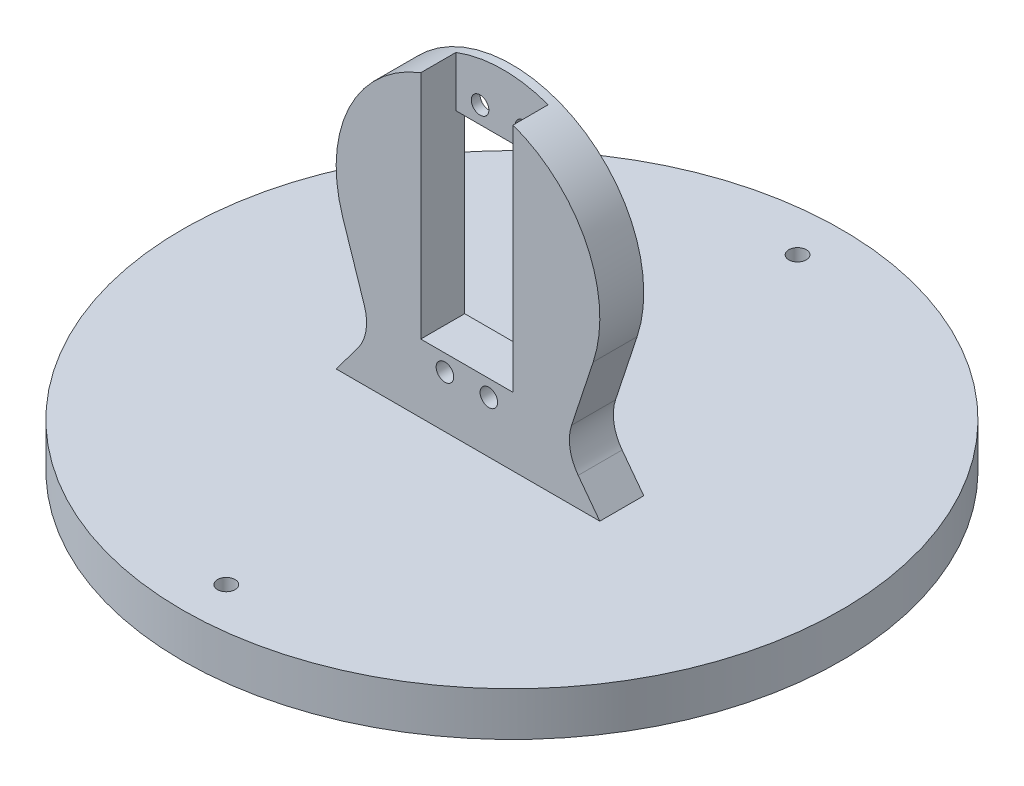
ISO-10303-21;
HEADER;
FILE_DESCRIPTION(('STEP AP214'),'2;1');
FILE_NAME('part.step','',(''),(''),'','','');
FILE_SCHEMA(('AUTOMOTIVE_DESIGN { 1 0 10303 214 1 1 1 1 }'));
ENDSEC;
DATA;
#1=APPLICATION_CONTEXT('core data for automotive mechanical design processes');
#2=APPLICATION_PROTOCOL_DEFINITION('international standard','automotive_design',2000,#1);
#3=PRODUCT_CONTEXT('',#1,'mechanical');
#4=PRODUCT('Part','Part','',(#3));
#5=PRODUCT_RELATED_PRODUCT_CATEGORY('part','',(#4));
#6=PRODUCT_DEFINITION_FORMATION('','',#4);
#7=PRODUCT_DEFINITION_CONTEXT('part definition',#1,'design');
#8=PRODUCT_DEFINITION('design','',#6,#7);
#9=PRODUCT_DEFINITION_SHAPE('','',#8);
#10=(LENGTH_UNIT() NAMED_UNIT(*) SI_UNIT(.MILLI.,.METRE.));
#11=(NAMED_UNIT(*) PLANE_ANGLE_UNIT() SI_UNIT($,.RADIAN.));
#12=(NAMED_UNIT(*) SI_UNIT($,.STERADIAN.) SOLID_ANGLE_UNIT());
#13=UNCERTAINTY_MEASURE_WITH_UNIT(LENGTH_MEASURE(1.E-05),#10,'distance_accuracy_value','');
#14=(GEOMETRIC_REPRESENTATION_CONTEXT(3) GLOBAL_UNCERTAINTY_ASSIGNED_CONTEXT((#13)) GLOBAL_UNIT_ASSIGNED_CONTEXT((#10,
#11,#12)) REPRESENTATION_CONTEXT('',''));
#15=CARTESIAN_POINT('',(0.,0.,0.));
#16=DIRECTION('',(0.,0.,1.));
#17=DIRECTION('',(1.,0.,0.));
#18=AXIS2_PLACEMENT_3D('',#15,#16,#17);
#19=CARTESIAN_POINT('',(0.,10.,0.));
#20=DIRECTION('',(0.,1.,0.));
#21=DIRECTION('',(0.,0.,1.));
#22=AXIS2_PLACEMENT_3D('',#19,#20,#21);
#23=PLANE('',#22);
#24=CARTESIAN_POINT('',(0.,10.,-65.));
#25=DIRECTION('',(0.,1.,0.));
#26=DIRECTION('',(0.,0.,1.));
#27=AXIS2_PLACEMENT_3D('',#24,#25,#26);
#28=CIRCLE('',#27,2.);
#29=CARTESIAN_POINT('',(0.,10.,-63.));
#30=VERTEX_POINT('',#29);
#31=EDGE_CURVE('E370',#30,#30,#28,.T.);
#32=ORIENTED_EDGE('',*,*,#31,.F.);
#33=EDGE_LOOP('',(#32));
#34=FACE_BOUND('',#33,.T.);
#35=CARTESIAN_POINT('',(0.,10.,0.));
#36=DIRECTION('',(0.,1.,0.));
#37=DIRECTION('',(0.,0.,1.));
#38=AXIS2_PLACEMENT_3D('',#35,#36,#37);
#39=CIRCLE('',#38,75.);
#40=CARTESIAN_POINT('',(0.,10.,75.));
#41=VERTEX_POINT('',#40);
#42=EDGE_CURVE('E137',#41,#41,#39,.T.);
#43=ORIENTED_EDGE('',*,*,#42,.T.);
#44=EDGE_LOOP('',(#43));
#45=FACE_BOUND('',#44,.T.);
#46=CARTESIAN_POINT('',(-4.53892574049607E-13,10.,65.));
#47=DIRECTION('',(0.,1.,0.));
#48=DIRECTION('',(0.,0.,1.));
#49=AXIS2_PLACEMENT_3D('',#46,#47,#48);
#50=CIRCLE('',#49,2.);
#51=CARTESIAN_POINT('',(-4.53892574049607E-13,10.,67.));
#52=VERTEX_POINT('',#51);
#53=EDGE_CURVE('E364',#52,#52,#50,.T.);
#54=ORIENTED_EDGE('',*,*,#53,.F.);
#55=EDGE_LOOP('',(#54));
#56=FACE_BOUND('',#55,.T.);
#57=DIRECTION('',(0.,0.,-1.));
#58=VECTOR('',#57,1.);
#59=CARTESIAN_POINT('',(30.,10.,2.));
#60=LINE('',#59,#58);
#61=CARTESIAN_POINT('',(30.,10.,10.));
#62=VERTEX_POINT('',#61);
#63=CARTESIAN_POINT('',(30.,10.,0.));
#64=VERTEX_POINT('',#63);
#65=EDGE_CURVE('E144',#62,#64,#60,.T.);
#66=ORIENTED_EDGE('',*,*,#65,.F.);
#67=DIRECTION('',(-1.,0.,0.));
#68=VECTOR('',#67,1.);
#69=CARTESIAN_POINT('',(0.,10.,10.));
#70=LINE('',#69,#68);
#71=CARTESIAN_POINT('',(-30.,10.,10.));
#72=VERTEX_POINT('',#71);
#73=EDGE_CURVE('E249',#62,#72,#70,.T.);
#74=ORIENTED_EDGE('',*,*,#73,.T.);
#75=DIRECTION('',(0.,0.,-1.));
#76=VECTOR('',#75,1.);
#77=CARTESIAN_POINT('',(-30.,10.,2.));
#78=LINE('',#77,#76);
#79=CARTESIAN_POINT('',(-30.,10.,0.));
#80=VERTEX_POINT('',#79);
#81=EDGE_CURVE('E152',#72,#80,#78,.T.);
#82=ORIENTED_EDGE('',*,*,#81,.T.);
#83=DIRECTION('',(1.,0.,0.));
#84=VECTOR('',#83,1.);
#85=CARTESIAN_POINT('',(0.,10.,0.));
#86=LINE('',#85,#84);
#87=EDGE_CURVE('E313',#80,#64,#86,.T.);
#88=ORIENTED_EDGE('',*,*,#87,.T.);
#89=EDGE_LOOP('',(#66,#74,#82,#88));
#90=FACE_BOUND('',#89,.T.);
#91=ADVANCED_FACE('F129',(#34,#45,#56,#90),#23,.T.);
#92=CARTESIAN_POINT('',(0.,0.,2.));
#93=DIRECTION('',(0.,0.,1.));
#94=DIRECTION('',(1.,0.,0.));
#95=AXIS2_PLACEMENT_3D('',#92,#93,#94);
#96=PLANE('',#95);
#97=CARTESIAN_POINT('',(4.75128860359023,70.3947044695423,2.));
#98=DIRECTION('',(0.,0.,1.));
#99=DIRECTION('',(1.,0.,0.));
#100=AXIS2_PLACEMENT_3D('',#97,#98,#99);
#101=CIRCLE('',#100,2.);
#102=CARTESIAN_POINT('',(6.75128860359023,70.3947044695423,2.));
#103=VERTEX_POINT('',#102);
#104=EDGE_CURVE('E299',#103,#103,#101,.F.);
#105=ORIENTED_EDGE('',*,*,#104,.T.);
#106=EDGE_LOOP('',(#105));
#107=FACE_BOUND('',#106,.T.);
#108=CARTESIAN_POINT('',(-5.24871139640977,70.3947044695423,2.));
#109=DIRECTION('',(0.,0.,1.));
#110=DIRECTION('',(1.,0.,0.));
#111=AXIS2_PLACEMENT_3D('',#108,#109,#110);
#112=CIRCLE('',#111,2.);
#113=CARTESIAN_POINT('',(-3.24871139640977,70.3947044695423,2.));
#114=VERTEX_POINT('',#113);
#115=EDGE_CURVE('E296',#114,#114,#112,.T.);
#116=ORIENTED_EDGE('',*,*,#115,.F.);
#117=EDGE_LOOP('',(#116));
#118=FACE_BOUND('',#117,.T.);
#119=DIRECTION('',(1.,0.,0.));
#120=VECTOR('',#119,1.);
#121=CARTESIAN_POINT('',(0.,66.515431829633,2.));
#122=LINE('',#121,#120);
#123=CARTESIAN_POINT('',(-10.7487113964098,66.515431829633,2.));
#124=VERTEX_POINT('',#123);
#125=CARTESIAN_POINT('',(10.2512886035903,66.515431829633,2.));
#126=VERTEX_POINT('',#125);
#127=EDGE_CURVE('E293',#124,#126,#122,.T.);
#128=ORIENTED_EDGE('',*,*,#127,.T.);
#129=DIRECTION('',(0.,-1.,0.));
#130=VECTOR('',#129,1.);
#131=CARTESIAN_POINT('',(10.2512886035903,0.,2.));
#132=LINE('',#131,#130);
#133=CARTESIAN_POINT('',(10.2512886035903,78.1941675168092,2.));
#134=VERTEX_POINT('',#133);
#135=EDGE_CURVE('E250',#134,#126,#132,.T.);
#136=ORIENTED_EDGE('',*,*,#135,.F.);
#137=CARTESIAN_POINT('',(0.,50.,2.));
#138=DIRECTION('',(0.,0.,1.));
#139=DIRECTION('',(1.,0.,0.));
#140=AXIS2_PLACEMENT_3D('',#137,#138,#139);
#141=CIRCLE('',#140,30.);
#142=CARTESIAN_POINT('',(-10.7487113964098,78.0083059701348,2.));
#143=VERTEX_POINT('',#142);
#144=EDGE_CURVE('E291',#134,#143,#141,.T.);
#145=ORIENTED_EDGE('',*,*,#144,.T.);
#146=DIRECTION('',(0.,-1.,0.));
#147=VECTOR('',#146,1.);
#148=CARTESIAN_POINT('',(-10.7487113964098,0.,2.));
#149=LINE('',#148,#147);
#150=EDGE_CURVE('E12',#143,#124,#149,.T.);
#151=ORIENTED_EDGE('',*,*,#150,.T.);
#152=EDGE_LOOP('',(#128,#136,#145,#151));
#153=FACE_BOUND('',#152,.T.);
#154=ADVANCED_FACE('F384',(#107,#118,#153),#96,.T.);
#155=CARTESIAN_POINT('',(0.,0.,0.));
#156=DIRECTION('',(0.,1.,0.));
#157=DIRECTION('',(0.,0.,1.));
#158=AXIS2_PLACEMENT_3D('',#155,#156,#157);
#159=PLANE('',#158);
#160=CARTESIAN_POINT('',(0.,0.,0.));
#161=DIRECTION('',(0.,1.,0.));
#162=DIRECTION('',(0.,0.,1.));
#163=AXIS2_PLACEMENT_3D('',#160,#161,#162);
#164=CIRCLE('',#163,75.);
#165=CARTESIAN_POINT('',(0.,0.,75.));
#166=VERTEX_POINT('',#165);
#167=EDGE_CURVE('E373',#166,#166,#164,.T.);
#168=ORIENTED_EDGE('',*,*,#167,.F.);
#169=EDGE_LOOP('',(#168));
#170=FACE_BOUND('',#169,.T.);
#171=CARTESIAN_POINT('',(0.,0.,-65.));
#172=DIRECTION('',(0.,1.,0.));
#173=DIRECTION('',(0.,0.,1.));
#174=AXIS2_PLACEMENT_3D('',#171,#172,#173);
#175=CIRCLE('',#174,2.);
#176=CARTESIAN_POINT('',(0.,0.,-63.));
#177=VERTEX_POINT('',#176);
#178=EDGE_CURVE('E367',#177,#177,#175,.T.);
#179=ORIENTED_EDGE('',*,*,#178,.T.);
#180=EDGE_LOOP('',(#179));
#181=FACE_BOUND('',#180,.T.);
#182=CARTESIAN_POINT('',(-4.53892574049607E-13,0.,65.));
#183=DIRECTION('',(0.,1.,0.));
#184=DIRECTION('',(0.,0.,1.));
#185=AXIS2_PLACEMENT_3D('',#182,#183,#184);
#186=CIRCLE('',#185,2.);
#187=CARTESIAN_POINT('',(-4.53892574049607E-13,0.,67.));
#188=VERTEX_POINT('',#187);
#189=EDGE_CURVE('E353',#188,#188,#186,.T.);
#190=ORIENTED_EDGE('',*,*,#189,.T.);
#191=EDGE_LOOP('',(#190));
#192=FACE_BOUND('',#191,.T.);
#193=ADVANCED_FACE('F381',(#170,#181,#192),#159,.F.);
#194=CARTESIAN_POINT('',(0.,10.,0.));
#195=DIRECTION('',(0.,-1.,0.));
#196=DIRECTION('',(0.,0.,-1.));
#197=AXIS2_PLACEMENT_3D('',#194,#195,#196);
#198=CYLINDRICAL_SURFACE('',#197,75.);
#199=ORIENTED_EDGE('',*,*,#42,.F.);
#200=EDGE_LOOP('',(#199));
#201=FACE_BOUND('',#200,.T.);
#202=ORIENTED_EDGE('',*,*,#167,.T.);
#203=EDGE_LOOP('',(#202));
#204=FACE_BOUND('',#203,.T.);
#205=ADVANCED_FACE('F131',(#201,#204),#198,.T.);
#206=CARTESIAN_POINT('',(0.,10.,-65.));
#207=DIRECTION('',(0.,-1.,0.));
#208=DIRECTION('',(0.,0.,-1.));
#209=AXIS2_PLACEMENT_3D('',#206,#207,#208);
#210=CYLINDRICAL_SURFACE('',#209,2.);
#211=ORIENTED_EDGE('',*,*,#31,.T.);
#212=EDGE_LOOP('',(#211));
#213=FACE_BOUND('',#212,.T.);
#214=ORIENTED_EDGE('',*,*,#178,.F.);
#215=EDGE_LOOP('',(#214));
#216=FACE_BOUND('',#215,.T.);
#217=ADVANCED_FACE('F392',(#213,#216),#210,.F.);
#218=CARTESIAN_POINT('',(-4.53892574049607E-13,10.,65.));
#219=DIRECTION('',(0.,-1.,0.));
#220=DIRECTION('',(0.,0.,-1.));
#221=AXIS2_PLACEMENT_3D('',#218,#219,#220);
#222=CYLINDRICAL_SURFACE('',#221,2.);
#223=ORIENTED_EDGE('',*,*,#53,.T.);
#224=EDGE_LOOP('',(#223));
#225=FACE_BOUND('',#224,.T.);
#226=ORIENTED_EDGE('',*,*,#189,.F.);
#227=EDGE_LOOP('',(#226));
#228=FACE_BOUND('',#227,.T.);
#229=ADVANCED_FACE('F389',(#225,#228),#222,.F.);
#230=CARTESIAN_POINT('',(10.2512886035903,0.,2.));
#231=DIRECTION('',(-1.,0.,0.));
#232=DIRECTION('',(0.,0.,1.));
#233=AXIS2_PLACEMENT_3D('',#230,#231,#232);
#234=PLANE('',#233);
#235=DIRECTION('',(0.,1.,0.));
#236=VECTOR('',#235,1.);
#237=CARTESIAN_POINT('',(10.2512886035903,0.,0.));
#238=LINE('',#237,#236);
#239=CARTESIAN_POINT('',(10.2512886035902,25.515431829633,0.));
#240=VERTEX_POINT('',#239);
#241=CARTESIAN_POINT('',(10.2512886035903,66.515431829633,0.));
#242=VERTEX_POINT('',#241);
#243=EDGE_CURVE('E321',#240,#242,#238,.T.);
#244=ORIENTED_EDGE('',*,*,#243,.F.);
#245=DIRECTION('',(0.,0.,-1.));
#246=VECTOR('',#245,1.);
#247=CARTESIAN_POINT('',(10.2512886035902,25.515431829633,2.));
#248=LINE('',#247,#246);
#249=CARTESIAN_POINT('',(10.2512886035903,25.515431829633,10.));
#250=VERTEX_POINT('',#249);
#251=EDGE_CURVE('E351',#250,#240,#248,.T.);
#252=ORIENTED_EDGE('',*,*,#251,.F.);
#253=DIRECTION('',(0.,-1.,0.));
#254=VECTOR('',#253,1.);
#255=CARTESIAN_POINT('',(10.2512886035903,0.,10.));
#256=LINE('',#255,#254);
#257=CARTESIAN_POINT('',(10.2512886035903,78.1941675168092,10.));
#258=VERTEX_POINT('',#257);
#259=EDGE_CURVE('E261',#258,#250,#256,.T.);
#260=ORIENTED_EDGE('',*,*,#259,.F.);
#261=DIRECTION('',(0.,0.,-1.));
#262=VECTOR('',#261,1.);
#263=CARTESIAN_POINT('',(10.2512886035903,78.1941675168092,10.));
#264=LINE('',#263,#262);
#265=EDGE_CURVE('E287',#258,#134,#264,.T.);
#266=ORIENTED_EDGE('',*,*,#265,.T.);
#267=ORIENTED_EDGE('',*,*,#135,.T.);
#268=DIRECTION('',(0.,0.,-1.));
#269=VECTOR('',#268,1.);
#270=CARTESIAN_POINT('',(10.2512886035903,66.515431829633,2.));
#271=LINE('',#270,#269);
#272=EDGE_CURVE('E344',#126,#242,#271,.T.);
#273=ORIENTED_EDGE('',*,*,#272,.T.);
#274=EDGE_LOOP('',(#244,#252,#260,#266,#267,#273));
#275=FACE_BOUND('',#274,.T.);
#276=ADVANCED_FACE('F391',(#275),#234,.T.);
#277=CARTESIAN_POINT('',(0.,25.515431829633,2.));
#278=DIRECTION('',(0.,1.,0.));
#279=DIRECTION('',(-1.,0.,0.));
#280=AXIS2_PLACEMENT_3D('',#277,#278,#279);
#281=PLANE('',#280);
#282=DIRECTION('',(1.,0.,0.));
#283=VECTOR('',#282,1.);
#284=CARTESIAN_POINT('',(0.,25.515431829633,0.));
#285=LINE('',#284,#283);
#286=CARTESIAN_POINT('',(-10.7487113964098,25.515431829633,0.));
#287=VERTEX_POINT('',#286);
#288=EDGE_CURVE('E324',#287,#240,#285,.T.);
#289=ORIENTED_EDGE('',*,*,#288,.F.);
#290=DIRECTION('',(0.,0.,-1.));
#291=VECTOR('',#290,1.);
#292=CARTESIAN_POINT('',(-10.7487113964098,25.515431829633,2.));
#293=LINE('',#292,#291);
#294=CARTESIAN_POINT('',(-10.7487113964098,25.515431829633,10.));
#295=VERTEX_POINT('',#294);
#296=EDGE_CURVE('E349',#295,#287,#293,.T.);
#297=ORIENTED_EDGE('',*,*,#296,.F.);
#298=DIRECTION('',(-1.,0.,0.));
#299=VECTOR('',#298,1.);
#300=CARTESIAN_POINT('',(0.,25.515431829633,10.));
#301=LINE('',#300,#299);
#302=EDGE_CURVE('E264',#250,#295,#301,.T.);
#303=ORIENTED_EDGE('',*,*,#302,.F.);
#304=ORIENTED_EDGE('',*,*,#251,.T.);
#305=EDGE_LOOP('',(#289,#297,#303,#304));
#306=FACE_BOUND('',#305,.T.);
#307=ADVANCED_FACE('F400',(#306),#281,.T.);
#308=CARTESIAN_POINT('',(-10.7487113964098,0.,2.));
#309=DIRECTION('',(1.,0.,0.));
#310=DIRECTION('',(0.,1.,0.));
#311=AXIS2_PLACEMENT_3D('',#308,#309,#310);
#312=PLANE('',#311);
#313=DIRECTION('',(0.,-1.,0.));
#314=VECTOR('',#313,1.);
#315=CARTESIAN_POINT('',(-10.7487113964098,0.,0.));
#316=LINE('',#315,#314);
#317=CARTESIAN_POINT('',(-10.7487113964098,66.515431829633,0.));
#318=VERTEX_POINT('',#317);
#319=EDGE_CURVE('E327',#318,#287,#316,.T.);
#320=ORIENTED_EDGE('',*,*,#319,.F.);
#321=DIRECTION('',(0.,0.,-1.));
#322=VECTOR('',#321,1.);
#323=CARTESIAN_POINT('',(-10.7487113964098,66.515431829633,2.));
#324=LINE('',#323,#322);
#325=EDGE_CURVE('E346',#124,#318,#324,.T.);
#326=ORIENTED_EDGE('',*,*,#325,.F.);
#327=ORIENTED_EDGE('',*,*,#150,.F.);
#328=DIRECTION('',(0.,0.,-1.));
#329=VECTOR('',#328,1.);
#330=CARTESIAN_POINT('',(-10.7487113964098,78.0083059701348,10.));
#331=LINE('',#330,#329);
#332=CARTESIAN_POINT('',(-10.7487113964098,78.0083059701348,10.));
#333=VERTEX_POINT('',#332);
#334=EDGE_CURVE('E281',#333,#143,#331,.T.);
#335=ORIENTED_EDGE('',*,*,#334,.F.);
#336=DIRECTION('',(0.,1.,0.));
#337=VECTOR('',#336,1.);
#338=CARTESIAN_POINT('',(-10.7487113964098,0.,10.));
#339=LINE('',#338,#337);
#340=EDGE_CURVE('E267',#295,#333,#339,.T.);
#341=ORIENTED_EDGE('',*,*,#340,.F.);
#342=ORIENTED_EDGE('',*,*,#296,.T.);
#343=EDGE_LOOP('',(#320,#326,#327,#335,#341,#342));
#344=FACE_BOUND('',#343,.T.);
#345=ADVANCED_FACE('F435',(#344),#312,.T.);
#346=CARTESIAN_POINT('',(0.,50.,2.));
#347=DIRECTION('',(0.,0.,-1.));
#348=DIRECTION('',(-1.,0.,0.));
#349=AXIS2_PLACEMENT_3D('',#346,#347,#348);
#350=CYLINDRICAL_SURFACE('',#349,30.);
#351=CARTESIAN_POINT('',(0.,50.,0.));
#352=DIRECTION('',(0.,0.,1.));
#353=DIRECTION('',(1.,0.,0.));
#354=AXIS2_PLACEMENT_3D('',#351,#352,#353);
#355=CIRCLE('',#354,30.);
#356=CARTESIAN_POINT('',(28.4915538818298,40.6068451839231,0.));
#357=VERTEX_POINT('',#356);
#358=CARTESIAN_POINT('',(-28.4915538818298,40.6068451839231,0.));
#359=VERTEX_POINT('',#358);
#360=EDGE_CURVE('E290',#357,#359,#355,.T.);
#361=ORIENTED_EDGE('',*,*,#360,.T.);
#362=DIRECTION('',(0.,0.,-1.));
#363=VECTOR('',#362,1.);
#364=CARTESIAN_POINT('',(-28.4915538818298,40.6068451839231,2.));
#365=LINE('',#364,#363);
#366=CARTESIAN_POINT('',(-28.4915538818298,40.6068451839231,10.));
#367=VERTEX_POINT('',#366);
#368=EDGE_CURVE('E347',#367,#359,#365,.T.);
#369=ORIENTED_EDGE('',*,*,#368,.F.);
#370=CARTESIAN_POINT('',(0.,50.,10.));
#371=DIRECTION('',(0.,0.,1.));
#372=DIRECTION('',(1.,0.,0.));
#373=AXIS2_PLACEMENT_3D('',#370,#371,#372);
#374=CIRCLE('',#373,30.);
#375=EDGE_CURVE('E269',#333,#367,#374,.T.);
#376=ORIENTED_EDGE('',*,*,#375,.F.);
#377=ORIENTED_EDGE('',*,*,#334,.T.);
#378=ORIENTED_EDGE('',*,*,#144,.F.);
#379=ORIENTED_EDGE('',*,*,#265,.F.);
#380=CARTESIAN_POINT('',(0.,50.,10.));
#381=DIRECTION('',(0.,0.,1.));
#382=DIRECTION('',(1.,0.,0.));
#383=AXIS2_PLACEMENT_3D('',#380,#381,#382);
#384=CIRCLE('',#383,30.);
#385=CARTESIAN_POINT('',(28.4915538818298,40.6068451839231,10.));
#386=VERTEX_POINT('',#385);
#387=EDGE_CURVE('E256',#386,#258,#384,.T.);
#388=ORIENTED_EDGE('',*,*,#387,.F.);
#389=DIRECTION('',(0.,0.,-1.));
#390=VECTOR('',#389,1.);
#391=CARTESIAN_POINT('',(28.4915538818298,40.6068451839231,2.));
#392=LINE('',#391,#390);
#393=EDGE_CURVE('E302',#386,#357,#392,.T.);
#394=ORIENTED_EDGE('',*,*,#393,.T.);
#395=EDGE_LOOP('',(#361,#369,#376,#377,#378,#379,#388,#394));
#396=FACE_BOUND('',#395,.T.);
#397=ADVANCED_FACE('F443',(#396),#350,.T.);
#398=CARTESIAN_POINT('',(-13.6234662950173,-4.49141273836642,2.));
#399=DIRECTION('',(0.94971846272766,0.313105160535898,0.));
#400=DIRECTION('',(-0.313105160535898,0.94971846272766,0.));
#401=AXIS2_PLACEMENT_3D('',#398,#399,#400);
#402=PLANE('',#401);
#403=DIRECTION('',(0.313105160535898,-0.94971846272766,0.));
#404=VECTOR('',#403,1.);
#405=CARTESIAN_POINT('',(-13.6234662950173,-4.49141273836642,0.));
#406=LINE('',#405,#404);
#407=CARTESIAN_POINT('',(-23.5767501294549,25.6991385963836,0.));
#408=VERTEX_POINT('',#407);
#409=EDGE_CURVE('E305',#359,#408,#406,.T.);
#410=ORIENTED_EDGE('',*,*,#409,.T.);
#411=DIRECTION('',(0.,0.,-1.));
#412=VECTOR('',#411,1.);
#413=CARTESIAN_POINT('',(-23.5767501294549,25.6991385963836,2.));
#414=LINE('',#413,#412);
#415=CARTESIAN_POINT('',(-23.5767501294549,25.6991385963836,10.));
#416=VERTEX_POINT('',#415);
#417=EDGE_CURVE('E360',#416,#408,#414,.T.);
#418=ORIENTED_EDGE('',*,*,#417,.F.);
#419=DIRECTION('',(-0.313105160535898,0.94971846272766,0.));
#420=VECTOR('',#419,1.);
#421=CARTESIAN_POINT('',(-13.6234662950173,-4.49141273836642,10.));
#422=LINE('',#421,#420);
#423=EDGE_CURVE('E272',#416,#367,#422,.T.);
#424=ORIENTED_EDGE('',*,*,#423,.T.);
#425=ORIENTED_EDGE('',*,*,#368,.T.);
#426=EDGE_LOOP('',(#410,#418,#424,#425));
#427=FACE_BOUND('',#426,.T.);
#428=ADVANCED_FACE('F451',(#427),#402,.F.);
#429=CARTESIAN_POINT('',(-33.0739347567315,22.5680869910246,2.));
#430=DIRECTION('',(0.,0.,-1.));
#431=DIRECTION('',(-1.,0.,0.));
#432=AXIS2_PLACEMENT_3D('',#429,#430,#431);
#433=CYLINDRICAL_SURFACE('',#432,10.);
#434=CARTESIAN_POINT('',(-33.0739347567315,22.5680869910246,0.));
#435=DIRECTION('',(0.,0.,1.));
#436=DIRECTION('',(1.,0.,0.));
#437=AXIS2_PLACEMENT_3D('',#434,#435,#436);
#438=CIRCLE('',#437,10.);
#439=CARTESIAN_POINT('',(-25.0739347567315,16.5680869910246,0.));
#440=VERTEX_POINT('',#439);
#441=EDGE_CURVE('E308',#440,#408,#438,.T.);
#442=ORIENTED_EDGE('',*,*,#441,.F.);
#443=DIRECTION('',(0.,0.,-1.));
#444=VECTOR('',#443,1.);
#445=CARTESIAN_POINT('',(-25.0739347567315,16.5680869910246,2.));
#446=LINE('',#445,#444);
#447=CARTESIAN_POINT('',(-25.0739347567315,16.5680869910246,10.));
#448=VERTEX_POINT('',#447);
#449=EDGE_CURVE('E358',#448,#440,#446,.T.);
#450=ORIENTED_EDGE('',*,*,#449,.F.);
#451=CARTESIAN_POINT('',(-33.0739347567315,22.5680869910246,10.));
#452=DIRECTION('',(0.,0.,1.));
#453=DIRECTION('',(1.,0.,0.));
#454=AXIS2_PLACEMENT_3D('',#451,#452,#453);
#455=CIRCLE('',#454,10.);
#456=EDGE_CURVE('E275',#448,#416,#455,.T.);
#457=ORIENTED_EDGE('',*,*,#456,.T.);
#458=ORIENTED_EDGE('',*,*,#417,.T.);
#459=EDGE_LOOP('',(#442,#450,#457,#458));
#460=FACE_BOUND('',#459,.T.);
#461=ADVANCED_FACE('F458',(#460),#433,.F.);
#462=CARTESIAN_POINT('',(-24.,18.,2.));
#463=DIRECTION('',(0.799999999999999,-0.600000000000001,0.));
#464=DIRECTION('',(0.600000000000001,0.799999999999999,0.));
#465=AXIS2_PLACEMENT_3D('',#462,#463,#464);
#466=PLANE('',#465);
#467=DIRECTION('',(-0.600000000000001,-0.799999999999999,0.));
#468=VECTOR('',#467,1.);
#469=CARTESIAN_POINT('',(-24.,18.,0.));
#470=LINE('',#469,#468);
#471=EDGE_CURVE('E311',#440,#80,#470,.T.);
#472=ORIENTED_EDGE('',*,*,#471,.T.);
#473=ORIENTED_EDGE('',*,*,#81,.F.);
#474=DIRECTION('',(0.600000000000001,0.799999999999999,0.));
#475=VECTOR('',#474,1.);
#476=CARTESIAN_POINT('',(-24.,18.,10.));
#477=LINE('',#476,#475);
#478=EDGE_CURVE('E278',#72,#448,#477,.T.);
#479=ORIENTED_EDGE('',*,*,#478,.T.);
#480=ORIENTED_EDGE('',*,*,#449,.T.);
#481=EDGE_LOOP('',(#472,#473,#479,#480));
#482=FACE_BOUND('',#481,.T.);
#483=ADVANCED_FACE('F466',(#482),#466,.F.);
#484=CARTESIAN_POINT('',(24.,18.,2.));
#485=DIRECTION('',(0.799999999999999,0.600000000000001,0.));
#486=DIRECTION('',(-0.600000000000001,0.799999999999999,0.));
#487=AXIS2_PLACEMENT_3D('',#484,#485,#486);
#488=PLANE('',#487);
#489=DIRECTION('',(0.600000000000001,-0.799999999999999,0.));
#490=VECTOR('',#489,1.);
#491=CARTESIAN_POINT('',(24.,18.,0.));
#492=LINE('',#491,#490);
#493=CARTESIAN_POINT('',(25.0739347567315,16.5680869910246,0.));
#494=VERTEX_POINT('',#493);
#495=EDGE_CURVE('E235',#494,#64,#492,.T.);
#496=ORIENTED_EDGE('',*,*,#495,.F.);
#497=DIRECTION('',(0.,0.,-1.));
#498=VECTOR('',#497,1.);
#499=CARTESIAN_POINT('',(25.0739347567315,16.5680869910246,2.));
#500=LINE('',#499,#498);
#501=CARTESIAN_POINT('',(25.0739347567315,16.5680869910246,10.));
#502=VERTEX_POINT('',#501);
#503=EDGE_CURVE('E230',#502,#494,#500,.T.);
#504=ORIENTED_EDGE('',*,*,#503,.F.);
#505=DIRECTION('',(-0.600000000000001,0.799999999999999,0.));
#506=VECTOR('',#505,1.);
#507=CARTESIAN_POINT('',(24.,18.,10.));
#508=LINE('',#507,#506);
#509=EDGE_CURVE('E233',#62,#502,#508,.T.);
#510=ORIENTED_EDGE('',*,*,#509,.F.);
#511=ORIENTED_EDGE('',*,*,#65,.T.);
#512=EDGE_LOOP('',(#496,#504,#510,#511));
#513=FACE_BOUND('',#512,.T.);
#514=ADVANCED_FACE('F232',(#513),#488,.T.);
#515=CARTESIAN_POINT('',(33.0739347567315,22.5680869910246,2.));
#516=DIRECTION('',(0.,0.,-1.));
#517=DIRECTION('',(-1.,0.,0.));
#518=AXIS2_PLACEMENT_3D('',#515,#516,#517);
#519=CYLINDRICAL_SURFACE('',#518,10.);
#520=CARTESIAN_POINT('',(33.0739347567315,22.5680869910246,0.));
#521=DIRECTION('',(0.,0.,1.));
#522=DIRECTION('',(1.,0.,0.));
#523=AXIS2_PLACEMENT_3D('',#520,#521,#522);
#524=CIRCLE('',#523,10.);
#525=CARTESIAN_POINT('',(23.5767501294549,25.6991385963836,0.));
#526=VERTEX_POINT('',#525);
#527=EDGE_CURVE('E316',#526,#494,#524,.T.);
#528=ORIENTED_EDGE('',*,*,#527,.F.);
#529=DIRECTION('',(0.,0.,-1.));
#530=VECTOR('',#529,1.);
#531=CARTESIAN_POINT('',(23.5767501294549,25.6991385963836,2.));
#532=LINE('',#531,#530);
#533=CARTESIAN_POINT('',(23.5767501294549,25.6991385963836,10.));
#534=VERTEX_POINT('',#533);
#535=EDGE_CURVE('E240',#534,#526,#532,.T.);
#536=ORIENTED_EDGE('',*,*,#535,.F.);
#537=CARTESIAN_POINT('',(33.0739347567315,22.5680869910246,10.));
#538=DIRECTION('',(0.,0.,1.));
#539=DIRECTION('',(1.,0.,0.));
#540=AXIS2_PLACEMENT_3D('',#537,#538,#539);
#541=CIRCLE('',#540,10.);
#542=EDGE_CURVE('E247',#534,#502,#541,.T.);
#543=ORIENTED_EDGE('',*,*,#542,.T.);
#544=ORIENTED_EDGE('',*,*,#503,.T.);
#545=EDGE_LOOP('',(#528,#536,#543,#544));
#546=FACE_BOUND('',#545,.T.);
#547=ADVANCED_FACE('F252',(#546),#519,.F.);
#548=CARTESIAN_POINT('',(-5.24871139640977,70.3947044695423,2.));
#549=DIRECTION('',(0.,0.,-1.));
#550=DIRECTION('',(-1.,0.,0.));
#551=AXIS2_PLACEMENT_3D('',#548,#549,#550);
#552=CYLINDRICAL_SURFACE('',#551,2.);
#553=ORIENTED_EDGE('',*,*,#115,.T.);
#554=EDGE_LOOP('',(#553));
#555=FACE_BOUND('',#554,.T.);
#556=CARTESIAN_POINT('',(-5.24871139640977,70.3947044695423,0.));
#557=DIRECTION('',(0.,0.,1.));
#558=DIRECTION('',(1.,0.,0.));
#559=AXIS2_PLACEMENT_3D('',#556,#557,#558);
#560=CIRCLE('',#559,2.);
#561=CARTESIAN_POINT('',(-3.24871139640977,70.3947044695423,0.));
#562=VERTEX_POINT('',#561);
#563=EDGE_CURVE('E339',#562,#562,#560,.T.);
#564=ORIENTED_EDGE('',*,*,#563,.F.);
#565=EDGE_LOOP('',(#564));
#566=FACE_BOUND('',#565,.T.);
#567=ADVANCED_FACE('F486',(#555,#566),#552,.F.);
#568=CARTESIAN_POINT('',(4.75128860359023,21.7647044695424,2.));
#569=DIRECTION('',(0.,0.,-1.));
#570=DIRECTION('',(-1.,0.,0.));
#571=AXIS2_PLACEMENT_3D('',#568,#569,#570);
#572=CYLINDRICAL_SURFACE('',#571,2.);
#573=CARTESIAN_POINT('',(4.75128860359023,21.7647044695424,0.));
#574=DIRECTION('',(0.,0.,1.));
#575=DIRECTION('',(1.,0.,0.));
#576=AXIS2_PLACEMENT_3D('',#573,#574,#575);
#577=CIRCLE('',#576,2.);
#578=CARTESIAN_POINT('',(6.75128860359023,21.7647044695424,0.));
#579=VERTEX_POINT('',#578);
#580=EDGE_CURVE('E336',#579,#579,#577,.F.);
#581=ORIENTED_EDGE('',*,*,#580,.T.);
#582=EDGE_LOOP('',(#581));
#583=FACE_BOUND('',#582,.T.);
#584=CARTESIAN_POINT('',(4.75128860359023,21.7647044695424,10.));
#585=DIRECTION('',(0.,0.,1.));
#586=DIRECTION('',(1.,0.,0.));
#587=AXIS2_PLACEMENT_3D('',#584,#585,#586);
#588=CIRCLE('',#587,2.);
#589=CARTESIAN_POINT('',(6.75128860359023,21.7647044695424,10.));
#590=VERTEX_POINT('',#589);
#591=EDGE_CURVE('E775',#590,#590,#588,.T.);
#592=ORIENTED_EDGE('',*,*,#591,.T.);
#593=EDGE_LOOP('',(#592));
#594=FACE_BOUND('',#593,.T.);
#595=ADVANCED_FACE('F493',(#583,#594),#572,.F.);
#596=CARTESIAN_POINT('',(-5.24871139640977,21.7647044695424,2.));
#597=DIRECTION('',(0.,0.,-1.));
#598=DIRECTION('',(-1.,0.,0.));
#599=AXIS2_PLACEMENT_3D('',#596,#597,#598);
#600=CYLINDRICAL_SURFACE('',#599,2.);
#601=CARTESIAN_POINT('',(-5.24871139640977,21.7647044695424,0.));
#602=DIRECTION('',(0.,0.,1.));
#603=DIRECTION('',(1.,0.,0.));
#604=AXIS2_PLACEMENT_3D('',#601,#602,#603);
#605=CIRCLE('',#604,2.);
#606=CARTESIAN_POINT('',(-3.24871139640977,21.7647044695424,0.));
#607=VERTEX_POINT('',#606);
#608=EDGE_CURVE('E333',#607,#607,#605,.T.);
#609=ORIENTED_EDGE('',*,*,#608,.F.);
#610=EDGE_LOOP('',(#609));
#611=FACE_BOUND('',#610,.T.);
#612=CARTESIAN_POINT('',(-5.24871139640977,21.7647044695424,10.));
#613=DIRECTION('',(0.,0.,1.));
#614=DIRECTION('',(1.,0.,0.));
#615=AXIS2_PLACEMENT_3D('',#612,#613,#614);
#616=CIRCLE('',#615,2.);
#617=CARTESIAN_POINT('',(-3.24871139640977,21.7647044695424,10.));
#618=VERTEX_POINT('',#617);
#619=EDGE_CURVE('E284',#618,#618,#616,.T.);
#620=ORIENTED_EDGE('',*,*,#619,.T.);
#621=EDGE_LOOP('',(#620));
#622=FACE_BOUND('',#621,.T.);
#623=ADVANCED_FACE('F500',(#611,#622),#600,.F.);
#624=CARTESIAN_POINT('',(0.,66.515431829633,2.));
#625=DIRECTION('',(0.,1.,0.));
#626=DIRECTION('',(0.,0.,1.));
#627=AXIS2_PLACEMENT_3D('',#624,#625,#626);
#628=PLANE('',#627);
#629=DIRECTION('',(1.,0.,0.));
#630=VECTOR('',#629,1.);
#631=CARTESIAN_POINT('',(0.,66.515431829633,0.));
#632=LINE('',#631,#630);
#633=EDGE_CURVE('E330',#318,#242,#632,.T.);
#634=ORIENTED_EDGE('',*,*,#633,.T.);
#635=ORIENTED_EDGE('',*,*,#272,.F.);
#636=ORIENTED_EDGE('',*,*,#127,.F.);
#637=ORIENTED_EDGE('',*,*,#325,.T.);
#638=EDGE_LOOP('',(#634,#635,#636,#637));
#639=FACE_BOUND('',#638,.T.);
#640=ADVANCED_FACE('F508',(#639),#628,.F.);
#641=CARTESIAN_POINT('',(13.6234662950173,-4.49141273836642,2.));
#642=DIRECTION('',(0.94971846272766,-0.313105160535898,0.));
#643=DIRECTION('',(0.313105160535898,0.94971846272766,0.));
#644=AXIS2_PLACEMENT_3D('',#641,#642,#643);
#645=PLANE('',#644);
#646=DIRECTION('',(-0.313105160535898,-0.94971846272766,0.));
#647=VECTOR('',#646,1.);
#648=CARTESIAN_POINT('',(13.6234662950173,-4.49141273836642,0.));
#649=LINE('',#648,#647);
#650=EDGE_CURVE('E318',#357,#526,#649,.T.);
#651=ORIENTED_EDGE('',*,*,#650,.F.);
#652=ORIENTED_EDGE('',*,*,#393,.F.);
#653=DIRECTION('',(0.313105160535898,0.94971846272766,0.));
#654=VECTOR('',#653,1.);
#655=CARTESIAN_POINT('',(13.6234662950173,-4.49141273836642,10.));
#656=LINE('',#655,#654);
#657=EDGE_CURVE('E254',#534,#386,#656,.T.);
#658=ORIENTED_EDGE('',*,*,#657,.F.);
#659=ORIENTED_EDGE('',*,*,#535,.T.);
#660=EDGE_LOOP('',(#651,#652,#658,#659));
#661=FACE_BOUND('',#660,.T.);
#662=ADVANCED_FACE('F516',(#661),#645,.T.);
#663=CARTESIAN_POINT('',(4.75128860359023,70.3947044695423,2.));
#664=DIRECTION('',(0.,0.,-1.));
#665=DIRECTION('',(-1.,0.,0.));
#666=AXIS2_PLACEMENT_3D('',#663,#664,#665);
#667=CYLINDRICAL_SURFACE('',#666,2.);
#668=ORIENTED_EDGE('',*,*,#104,.F.);
#669=EDGE_LOOP('',(#668));
#670=FACE_BOUND('',#669,.T.);
#671=CARTESIAN_POINT('',(4.75128860359023,70.3947044695423,0.));
#672=DIRECTION('',(0.,0.,1.));
#673=DIRECTION('',(1.,0.,0.));
#674=AXIS2_PLACEMENT_3D('',#671,#672,#673);
#675=CIRCLE('',#674,2.);
#676=CARTESIAN_POINT('',(6.75128860359023,70.3947044695423,0.));
#677=VERTEX_POINT('',#676);
#678=EDGE_CURVE('E294',#677,#677,#675,.F.);
#679=ORIENTED_EDGE('',*,*,#678,.T.);
#680=EDGE_LOOP('',(#679));
#681=FACE_BOUND('',#680,.T.);
#682=ADVANCED_FACE('F524',(#670,#681),#667,.F.);
#683=CARTESIAN_POINT('',(0.,0.,0.));
#684=DIRECTION('',(0.,0.,1.));
#685=DIRECTION('',(1.,0.,0.));
#686=AXIS2_PLACEMENT_3D('',#683,#684,#685);
#687=PLANE('',#686);
#688=ORIENTED_EDGE('',*,*,#360,.F.);
#689=ORIENTED_EDGE('',*,*,#650,.T.);
#690=ORIENTED_EDGE('',*,*,#527,.T.);
#691=ORIENTED_EDGE('',*,*,#495,.T.);
#692=ORIENTED_EDGE('',*,*,#87,.F.);
#693=ORIENTED_EDGE('',*,*,#471,.F.);
#694=ORIENTED_EDGE('',*,*,#441,.T.);
#695=ORIENTED_EDGE('',*,*,#409,.F.);
#696=EDGE_LOOP('',(#688,#689,#690,#691,#692,#693,#694,#695));
#697=FACE_BOUND('',#696,.T.);
#698=ORIENTED_EDGE('',*,*,#243,.T.);
#699=ORIENTED_EDGE('',*,*,#633,.F.);
#700=ORIENTED_EDGE('',*,*,#319,.T.);
#701=ORIENTED_EDGE('',*,*,#288,.T.);
#702=EDGE_LOOP('',(#698,#699,#700,#701));
#703=FACE_BOUND('',#702,.T.);
#704=ORIENTED_EDGE('',*,*,#608,.T.);
#705=EDGE_LOOP('',(#704));
#706=FACE_BOUND('',#705,.T.);
#707=ORIENTED_EDGE('',*,*,#580,.F.);
#708=EDGE_LOOP('',(#707));
#709=FACE_BOUND('',#708,.T.);
#710=ORIENTED_EDGE('',*,*,#563,.T.);
#711=EDGE_LOOP('',(#710));
#712=FACE_BOUND('',#711,.T.);
#713=ORIENTED_EDGE('',*,*,#678,.F.);
#714=EDGE_LOOP('',(#713));
#715=FACE_BOUND('',#714,.T.);
#716=ADVANCED_FACE('F532',(#697,#703,#706,#709,#712,#715),#687,.F.);
#717=CARTESIAN_POINT('',(33.0739347567315,22.5680869910246,10.));
#718=DIRECTION('',(0.,0.,1.));
#719=DIRECTION('',(1.,0.,0.));
#720=AXIS2_PLACEMENT_3D('',#717,#718,#719);
#721=PLANE('',#720);
#722=ORIENTED_EDGE('',*,*,#619,.F.);
#723=EDGE_LOOP('',(#722));
#724=FACE_BOUND('',#723,.T.);
#725=ORIENTED_EDGE('',*,*,#509,.T.);
#726=ORIENTED_EDGE('',*,*,#542,.F.);
#727=ORIENTED_EDGE('',*,*,#657,.T.);
#728=ORIENTED_EDGE('',*,*,#387,.T.);
#729=ORIENTED_EDGE('',*,*,#259,.T.);
#730=ORIENTED_EDGE('',*,*,#302,.T.);
#731=ORIENTED_EDGE('',*,*,#340,.T.);
#732=ORIENTED_EDGE('',*,*,#375,.T.);
#733=ORIENTED_EDGE('',*,*,#423,.F.);
#734=ORIENTED_EDGE('',*,*,#456,.F.);
#735=ORIENTED_EDGE('',*,*,#478,.F.);
#736=ORIENTED_EDGE('',*,*,#73,.F.);
#737=EDGE_LOOP('',(#725,#726,#727,#728,#729,#730,#731,#732,#733,#734,#735,#736));
#738=FACE_BOUND('',#737,.T.);
#739=ORIENTED_EDGE('',*,*,#591,.F.);
#740=EDGE_LOOP('',(#739));
#741=FACE_BOUND('',#740,.T.);
#742=ADVANCED_FACE('F244',(#724,#738,#741),#721,.T.);
#743=CLOSED_SHELL('',(#91,#154,#193,#205,#217,#229,#276,#307,#345,#397,#428,#461,#483,#514,#547,
#567,#595,#623,#640,#662,#682,#716,#742));
#744=MANIFOLD_SOLID_BREP('B2',#743);
#745=ADVANCED_BREP_SHAPE_REPRESENTATION('',(#18,#744),#14);
#746=SHAPE_DEFINITION_REPRESENTATION(#9,#745);
ENDSEC;
END-ISO-10303-21;
